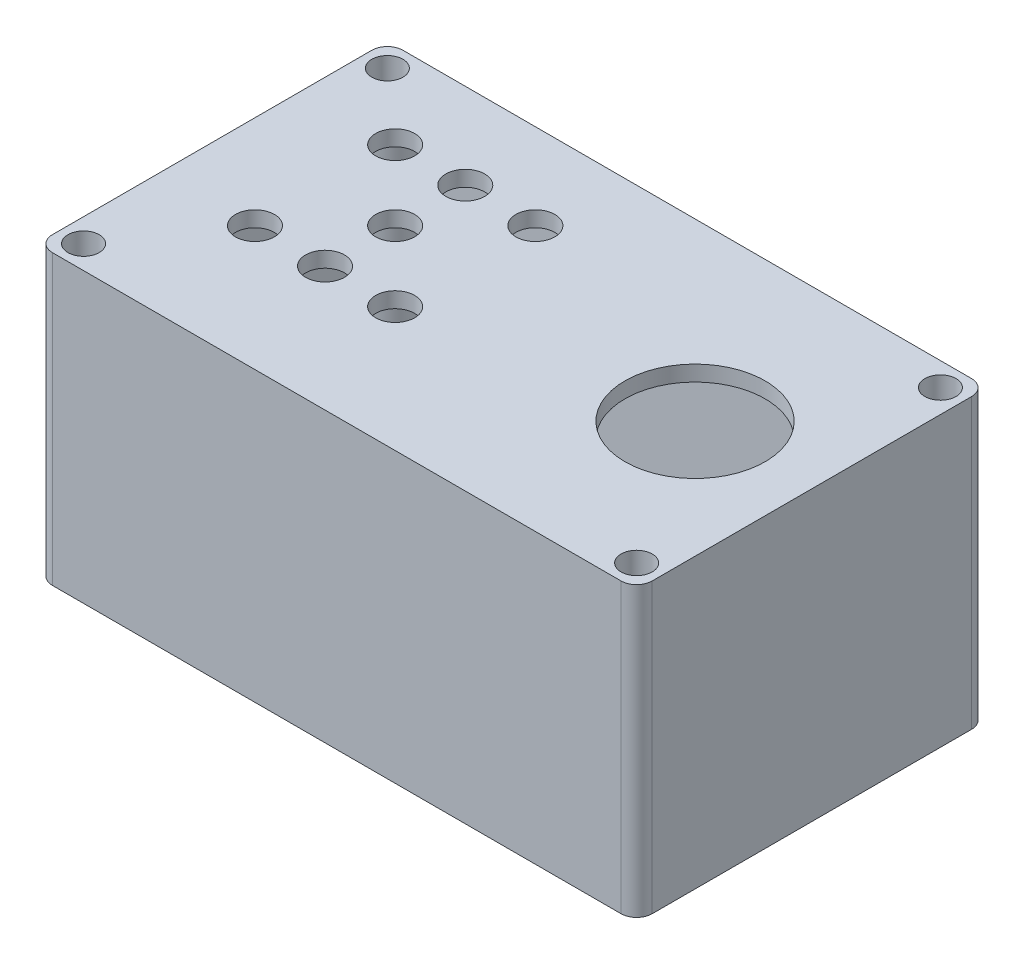
ISO-10303-21;
HEADER;
FILE_DESCRIPTION(('STEP AP214'),'2;1');
FILE_NAME('part.step','',(''),(''),'','','');
FILE_SCHEMA(('AUTOMOTIVE_DESIGN { 1 0 10303 214 1 1 1 1 }'));
ENDSEC;
DATA;
#1=APPLICATION_CONTEXT('core data for automotive mechanical design processes');
#2=APPLICATION_PROTOCOL_DEFINITION('international standard','automotive_design',2000,#1);
#3=PRODUCT_CONTEXT('',#1,'mechanical');
#4=PRODUCT('Part','Part','',(#3));
#5=PRODUCT_RELATED_PRODUCT_CATEGORY('part','',(#4));
#6=PRODUCT_DEFINITION_FORMATION('','',#4);
#7=PRODUCT_DEFINITION_CONTEXT('part definition',#1,'design');
#8=PRODUCT_DEFINITION('design','',#6,#7);
#9=PRODUCT_DEFINITION_SHAPE('','',#8);
#10=(LENGTH_UNIT() NAMED_UNIT(*) SI_UNIT(.MILLI.,.METRE.));
#11=(NAMED_UNIT(*) PLANE_ANGLE_UNIT() SI_UNIT($,.RADIAN.));
#12=(NAMED_UNIT(*) SI_UNIT($,.STERADIAN.) SOLID_ANGLE_UNIT());
#13=UNCERTAINTY_MEASURE_WITH_UNIT(LENGTH_MEASURE(1.E-05),#10,'distance_accuracy_value','');
#14=(GEOMETRIC_REPRESENTATION_CONTEXT(3) GLOBAL_UNCERTAINTY_ASSIGNED_CONTEXT((#13)) GLOBAL_UNIT_ASSIGNED_CONTEXT((#10,
#11,#12)) REPRESENTATION_CONTEXT('',''));
#15=CARTESIAN_POINT('',(0.,0.,0.));
#16=DIRECTION('',(0.,0.,1.));
#17=DIRECTION('',(1.,0.,0.));
#18=AXIS2_PLACEMENT_3D('',#15,#16,#17);
#19=CARTESIAN_POINT('',(-8.50000000000001,0.,-11.5));
#20=DIRECTION('',(0.,1.,0.));
#21=DIRECTION('',(0.,0.,1.));
#22=AXIS2_PLACEMENT_3D('',#19,#20,#21);
#23=CYLINDRICAL_SURFACE('',#22,2.5);
#24=CARTESIAN_POINT('',(-8.50000000000001,35.,-11.5));
#25=DIRECTION('',(0.,-1.,0.));
#26=DIRECTION('',(0.,0.,-1.));
#27=AXIS2_PLACEMENT_3D('',#24,#25,#26);
#28=CIRCLE('',#27,2.5);
#29=CARTESIAN_POINT('',(-8.50000000000001,35.,-14.));
#30=VERTEX_POINT('',#29);
#31=EDGE_CURVE('E303',#30,#30,#28,.T.);
#32=ORIENTED_EDGE('',*,*,#31,.T.);
#33=EDGE_LOOP('',(#32));
#34=FACE_BOUND('',#33,.T.);
#35=CARTESIAN_POINT('',(-8.50000000000001,37.,-11.5));
#36=DIRECTION('',(0.,1.,0.));
#37=DIRECTION('',(0.,0.,1.));
#38=AXIS2_PLACEMENT_3D('',#35,#36,#37);
#39=CIRCLE('',#38,2.5);
#40=CARTESIAN_POINT('',(-8.50000000000001,37.,-9.));
#41=VERTEX_POINT('',#40);
#42=EDGE_CURVE('E324',#41,#41,#39,.T.);
#43=ORIENTED_EDGE('',*,*,#42,.T.);
#44=EDGE_LOOP('',(#43));
#45=FACE_BOUND('',#44,.T.);
#46=ADVANCED_FACE('F41',(#34,#45),#23,.F.);
#47=CARTESIAN_POINT('',(0.,0.,0.));
#48=DIRECTION('',(0.,-1.,0.));
#49=DIRECTION('',(0.,0.,-1.));
#50=AXIS2_PLACEMENT_3D('',#47,#48,#49);
#51=PLANE('',#50);
#52=CARTESIAN_POINT('',(-35.5,0.,-19.5));
#53=DIRECTION('',(0.,-1.,0.));
#54=DIRECTION('',(0.,0.,1.));
#55=AXIS2_PLACEMENT_3D('',#52,#53,#54);
#56=CIRCLE('',#55,2.);
#57=CARTESIAN_POINT('',(-35.5,0.,-17.5));
#58=VERTEX_POINT('',#57);
#59=EDGE_CURVE('E255',#58,#58,#56,.T.);
#60=ORIENTED_EDGE('',*,*,#59,.F.);
#61=EDGE_LOOP('',(#60));
#62=FACE_BOUND('',#61,.T.);
#63=CARTESIAN_POINT('',(35.5,0.,-19.5));
#64=DIRECTION('',(0.,-1.,0.));
#65=DIRECTION('',(0.,0.,-1.));
#66=AXIS2_PLACEMENT_3D('',#63,#64,#65);
#67=CIRCLE('',#66,2.);
#68=CARTESIAN_POINT('',(35.5,0.,-21.5));
#69=VERTEX_POINT('',#68);
#70=EDGE_CURVE('E269',#69,#69,#67,.T.);
#71=ORIENTED_EDGE('',*,*,#70,.F.);
#72=EDGE_LOOP('',(#71));
#73=FACE_BOUND('',#72,.T.);
#74=CARTESIAN_POINT('',(35.5,0.,19.5));
#75=DIRECTION('',(0.,-1.,0.));
#76=DIRECTION('',(0.,0.,1.));
#77=AXIS2_PLACEMENT_3D('',#74,#75,#76);
#78=CIRCLE('',#77,2.);
#79=CARTESIAN_POINT('',(35.5,0.,21.5));
#80=VERTEX_POINT('',#79);
#81=EDGE_CURVE('E261',#80,#80,#78,.T.);
#82=ORIENTED_EDGE('',*,*,#81,.F.);
#83=EDGE_LOOP('',(#82));
#84=FACE_BOUND('',#83,.T.);
#85=CARTESIAN_POINT('',(-35.5,0.,19.5));
#86=DIRECTION('',(0.,-1.,0.));
#87=DIRECTION('',(0.,0.,-1.));
#88=AXIS2_PLACEMENT_3D('',#85,#86,#87);
#89=CIRCLE('',#88,2.);
#90=CARTESIAN_POINT('',(-35.5,0.,17.5));
#91=VERTEX_POINT('',#90);
#92=EDGE_CURVE('E260',#91,#91,#89,.T.);
#93=ORIENTED_EDGE('',*,*,#92,.F.);
#94=EDGE_LOOP('',(#93));
#95=FACE_BOUND('',#94,.T.);
#96=DIRECTION('',(-1.,0.,0.));
#97=VECTOR('',#96,1.);
#98=CARTESIAN_POINT('',(-38.5,0.,-22.5));
#99=LINE('',#98,#97);
#100=CARTESIAN_POINT('',(36.5,0.,-22.5));
#101=VERTEX_POINT('',#100);
#102=CARTESIAN_POINT('',(-36.5,0.,-22.5));
#103=VERTEX_POINT('',#102);
#104=EDGE_CURVE('E307',#101,#103,#99,.T.);
#105=ORIENTED_EDGE('',*,*,#104,.F.);
#106=CARTESIAN_POINT('',(36.5,0.,-20.5));
#107=DIRECTION('',(0.,-1.,0.));
#108=DIRECTION('',(0.,0.,-1.));
#109=AXIS2_PLACEMENT_3D('',#106,#107,#108);
#110=CIRCLE('',#109,2.);
#111=CARTESIAN_POINT('',(38.5,0.,-20.5));
#112=VERTEX_POINT('',#111);
#113=EDGE_CURVE('E362',#101,#112,#110,.T.);
#114=ORIENTED_EDGE('',*,*,#113,.T.);
#115=DIRECTION('',(0.,0.,-1.));
#116=VECTOR('',#115,1.);
#117=CARTESIAN_POINT('',(38.5,0.,22.5));
#118=LINE('',#117,#116);
#119=CARTESIAN_POINT('',(38.5,0.,20.5));
#120=VERTEX_POINT('',#119);
#121=EDGE_CURVE('E284',#120,#112,#118,.T.);
#122=ORIENTED_EDGE('',*,*,#121,.F.);
#123=CARTESIAN_POINT('',(36.5,0.,20.5));
#124=DIRECTION('',(0.,-1.,0.));
#125=DIRECTION('',(0.,0.,-1.));
#126=AXIS2_PLACEMENT_3D('',#123,#124,#125);
#127=CIRCLE('',#126,2.);
#128=CARTESIAN_POINT('',(36.5,0.,22.5));
#129=VERTEX_POINT('',#128);
#130=EDGE_CURVE('E359',#120,#129,#127,.T.);
#131=ORIENTED_EDGE('',*,*,#130,.T.);
#132=DIRECTION('',(1.,0.,0.));
#133=VECTOR('',#132,1.);
#134=CARTESIAN_POINT('',(-38.5,0.,22.5));
#135=LINE('',#134,#133);
#136=CARTESIAN_POINT('',(-36.5,0.,22.5));
#137=VERTEX_POINT('',#136);
#138=EDGE_CURVE('E293',#137,#129,#135,.T.);
#139=ORIENTED_EDGE('',*,*,#138,.F.);
#140=CARTESIAN_POINT('',(-36.5,0.,20.5));
#141=DIRECTION('',(0.,-1.,0.));
#142=DIRECTION('',(0.,0.,-1.));
#143=AXIS2_PLACEMENT_3D('',#140,#141,#142);
#144=CIRCLE('',#143,2.);
#145=CARTESIAN_POINT('',(-38.5,0.,20.5));
#146=VERTEX_POINT('',#145);
#147=EDGE_CURVE('E356',#137,#146,#144,.T.);
#148=ORIENTED_EDGE('',*,*,#147,.T.);
#149=DIRECTION('',(0.,0.,1.));
#150=VECTOR('',#149,1.);
#151=CARTESIAN_POINT('',(-38.5,0.,22.5));
#152=LINE('',#151,#150);
#153=CARTESIAN_POINT('',(-38.5,0.,-20.5));
#154=VERTEX_POINT('',#153);
#155=EDGE_CURVE('E311',#154,#146,#152,.T.);
#156=ORIENTED_EDGE('',*,*,#155,.F.);
#157=CARTESIAN_POINT('',(-36.5,0.,-20.5));
#158=DIRECTION('',(0.,-1.,0.));
#159=DIRECTION('',(0.,0.,-1.));
#160=AXIS2_PLACEMENT_3D('',#157,#158,#159);
#161=CIRCLE('',#160,2.);
#162=EDGE_CURVE('E353',#154,#103,#161,.T.);
#163=ORIENTED_EDGE('',*,*,#162,.T.);
#164=EDGE_LOOP('',(#105,#114,#122,#131,#139,#148,#156,#163));
#165=FACE_BOUND('',#164,.T.);
#166=CARTESIAN_POINT('',(-35.5,0.,19.5));
#167=DIRECTION('',(0.,-1.,0.));
#168=DIRECTION('',(0.,0.,-1.));
#169=AXIS2_PLACEMENT_3D('',#166,#167,#168);
#170=CIRCLE('',#169,4.);
#171=CARTESIAN_POINT('',(-36.5,0.,15.6270166537926));
#172=VERTEX_POINT('',#171);
#173=CARTESIAN_POINT('',(-31.6270166537926,0.,20.5));
#174=VERTEX_POINT('',#173);
#175=EDGE_CURVE('E208',#172,#174,#170,.T.);
#176=ORIENTED_EDGE('',*,*,#175,.T.);
#177=DIRECTION('',(1.,0.,0.));
#178=VECTOR('',#177,1.);
#179=CARTESIAN_POINT('',(0.,0.,20.5));
#180=LINE('',#179,#178);
#181=CARTESIAN_POINT('',(31.6270166537926,0.,20.5));
#182=VERTEX_POINT('',#181);
#183=EDGE_CURVE('E216',#174,#182,#180,.T.);
#184=ORIENTED_EDGE('',*,*,#183,.T.);
#185=CARTESIAN_POINT('',(35.5,0.,19.5));
#186=DIRECTION('',(0.,-1.,0.));
#187=DIRECTION('',(0.,0.,-1.));
#188=AXIS2_PLACEMENT_3D('',#185,#186,#187);
#189=CIRCLE('',#188,4.);
#190=CARTESIAN_POINT('',(36.5,0.,15.6270166537926));
#191=VERTEX_POINT('',#190);
#192=EDGE_CURVE('E203',#182,#191,#189,.T.);
#193=ORIENTED_EDGE('',*,*,#192,.T.);
#194=DIRECTION('',(0.,0.,-1.));
#195=VECTOR('',#194,1.);
#196=CARTESIAN_POINT('',(36.5,0.,0.));
#197=LINE('',#196,#195);
#198=CARTESIAN_POINT('',(36.5,0.,-15.6270166537926));
#199=VERTEX_POINT('',#198);
#200=EDGE_CURVE('E211',#191,#199,#197,.T.);
#201=ORIENTED_EDGE('',*,*,#200,.T.);
#202=CARTESIAN_POINT('',(35.5,0.,-19.5));
#203=DIRECTION('',(0.,-1.,0.));
#204=DIRECTION('',(0.,0.,-1.));
#205=AXIS2_PLACEMENT_3D('',#202,#203,#204);
#206=CIRCLE('',#205,4.);
#207=CARTESIAN_POINT('',(31.6270166537926,0.,-20.5));
#208=VERTEX_POINT('',#207);
#209=EDGE_CURVE('E177',#199,#208,#206,.T.);
#210=ORIENTED_EDGE('',*,*,#209,.T.);
#211=DIRECTION('',(-1.,0.,0.));
#212=VECTOR('',#211,1.);
#213=CARTESIAN_POINT('',(0.,0.,-20.5));
#214=LINE('',#213,#212);
#215=CARTESIAN_POINT('',(-31.6270166537926,0.,-20.5));
#216=VERTEX_POINT('',#215);
#217=EDGE_CURVE('E215',#208,#216,#214,.T.);
#218=ORIENTED_EDGE('',*,*,#217,.T.);
#219=CARTESIAN_POINT('',(-35.5,0.,-19.5));
#220=DIRECTION('',(0.,-1.,0.));
#221=DIRECTION('',(0.,0.,-1.));
#222=AXIS2_PLACEMENT_3D('',#219,#220,#221);
#223=CIRCLE('',#222,4.);
#224=CARTESIAN_POINT('',(-36.5,0.,-15.6270166537926));
#225=VERTEX_POINT('',#224);
#226=EDGE_CURVE('E178',#216,#225,#223,.T.);
#227=ORIENTED_EDGE('',*,*,#226,.T.);
#228=DIRECTION('',(0.,0.,1.));
#229=VECTOR('',#228,1.);
#230=CARTESIAN_POINT('',(-36.5,0.,0.));
#231=LINE('',#230,#229);
#232=EDGE_CURVE('E162',#225,#172,#231,.T.);
#233=ORIENTED_EDGE('',*,*,#232,.T.);
#234=EDGE_LOOP('',(#176,#184,#193,#201,#210,#218,#227,#233));
#235=FACE_BOUND('',#234,.T.);
#236=ADVANCED_FACE('F400',(#62,#73,#84,#95,#165,#235),#51,.T.);
#237=CARTESIAN_POINT('',(38.5,37.,22.5));
#238=DIRECTION('',(-1.,0.,0.));
#239=DIRECTION('',(0.,0.,1.));
#240=AXIS2_PLACEMENT_3D('',#237,#238,#239);
#241=PLANE('',#240);
#242=ORIENTED_EDGE('',*,*,#121,.T.);
#243=DIRECTION('',(0.,-1.,0.));
#244=VECTOR('',#243,1.);
#245=CARTESIAN_POINT('',(38.5,37.,-20.5));
#246=LINE('',#245,#244);
#247=CARTESIAN_POINT('',(38.5,37.,-20.5));
#248=VERTEX_POINT('',#247);
#249=EDGE_CURVE('E369',#112,#248,#246,.F.);
#250=ORIENTED_EDGE('',*,*,#249,.T.);
#251=DIRECTION('',(0.,0.,-1.));
#252=VECTOR('',#251,1.);
#253=CARTESIAN_POINT('',(38.5,37.,22.5));
#254=LINE('',#253,#252);
#255=CARTESIAN_POINT('',(38.5,37.,20.5));
#256=VERTEX_POINT('',#255);
#257=EDGE_CURVE('E288',#256,#248,#254,.T.);
#258=ORIENTED_EDGE('',*,*,#257,.F.);
#259=DIRECTION('',(0.,-1.,0.));
#260=VECTOR('',#259,1.);
#261=CARTESIAN_POINT('',(38.5,37.,20.5));
#262=LINE('',#261,#260);
#263=EDGE_CURVE('E365',#256,#120,#262,.T.);
#264=ORIENTED_EDGE('',*,*,#263,.T.);
#265=EDGE_LOOP('',(#242,#250,#258,#264));
#266=FACE_BOUND('',#265,.T.);
#267=ADVANCED_FACE('F416',(#266),#241,.F.);
#268=CARTESIAN_POINT('',(-38.5,37.,-22.5));
#269=DIRECTION('',(0.,0.,1.));
#270=DIRECTION('',(1.,0.,0.));
#271=AXIS2_PLACEMENT_3D('',#268,#269,#270);
#272=PLANE('',#271);
#273=DIRECTION('',(-1.,0.,0.));
#274=VECTOR('',#273,1.);
#275=CARTESIAN_POINT('',(-38.5,37.,-22.5));
#276=LINE('',#275,#274);
#277=CARTESIAN_POINT('',(36.5,37.,-22.5));
#278=VERTEX_POINT('',#277);
#279=CARTESIAN_POINT('',(-36.5,37.,-22.5));
#280=VERTEX_POINT('',#279);
#281=EDGE_CURVE('E292',#278,#280,#276,.T.);
#282=ORIENTED_EDGE('',*,*,#281,.F.);
#283=DIRECTION('',(0.,-1.,0.));
#284=VECTOR('',#283,1.);
#285=CARTESIAN_POINT('',(36.5,37.,-22.5));
#286=LINE('',#285,#284);
#287=EDGE_CURVE('E349',#278,#101,#286,.T.);
#288=ORIENTED_EDGE('',*,*,#287,.T.);
#289=ORIENTED_EDGE('',*,*,#104,.T.);
#290=DIRECTION('',(0.,-1.,0.));
#291=VECTOR('',#290,1.);
#292=CARTESIAN_POINT('',(-36.5,37.,-22.5));
#293=LINE('',#292,#291);
#294=EDGE_CURVE('E328',#103,#280,#293,.F.);
#295=ORIENTED_EDGE('',*,*,#294,.T.);
#296=EDGE_LOOP('',(#282,#288,#289,#295));
#297=FACE_BOUND('',#296,.T.);
#298=ADVANCED_FACE('F424',(#297),#272,.F.);
#299=CARTESIAN_POINT('',(-38.5,37.,22.5));
#300=DIRECTION('',(1.,0.,0.));
#301=DIRECTION('',(0.,0.,-1.));
#302=AXIS2_PLACEMENT_3D('',#299,#300,#301);
#303=PLANE('',#302);
#304=ORIENTED_EDGE('',*,*,#155,.T.);
#305=DIRECTION('',(0.,-1.,0.));
#306=VECTOR('',#305,1.);
#307=CARTESIAN_POINT('',(-38.5,37.,20.5));
#308=LINE('',#307,#306);
#309=CARTESIAN_POINT('',(-38.5,37.,20.5));
#310=VERTEX_POINT('',#309);
#311=EDGE_CURVE('E11',#146,#310,#308,.F.);
#312=ORIENTED_EDGE('',*,*,#311,.T.);
#313=DIRECTION('',(0.,0.,1.));
#314=VECTOR('',#313,1.);
#315=CARTESIAN_POINT('',(-38.5,37.,22.5));
#316=LINE('',#315,#314);
#317=CARTESIAN_POINT('',(-38.5,37.,-20.5));
#318=VERTEX_POINT('',#317);
#319=EDGE_CURVE('E297',#318,#310,#316,.T.);
#320=ORIENTED_EDGE('',*,*,#319,.F.);
#321=DIRECTION('',(0.,-1.,0.));
#322=VECTOR('',#321,1.);
#323=CARTESIAN_POINT('',(-38.5,37.,-20.5));
#324=LINE('',#323,#322);
#325=EDGE_CURVE('E50',#318,#154,#324,.T.);
#326=ORIENTED_EDGE('',*,*,#325,.T.);
#327=EDGE_LOOP('',(#304,#312,#320,#326));
#328=FACE_BOUND('',#327,.T.);
#329=ADVANCED_FACE('F394',(#328),#303,.F.);
#330=CARTESIAN_POINT('',(-38.5,37.,22.5));
#331=DIRECTION('',(0.,0.,-1.));
#332=DIRECTION('',(-1.,0.,0.));
#333=AXIS2_PLACEMENT_3D('',#330,#331,#332);
#334=PLANE('',#333);
#335=ORIENTED_EDGE('',*,*,#138,.T.);
#336=DIRECTION('',(0.,-1.,0.));
#337=VECTOR('',#336,1.);
#338=CARTESIAN_POINT('',(36.5,37.,22.5));
#339=LINE('',#338,#337);
#340=CARTESIAN_POINT('',(36.5,37.,22.5));
#341=VERTEX_POINT('',#340);
#342=EDGE_CURVE('E57',#129,#341,#339,.F.);
#343=ORIENTED_EDGE('',*,*,#342,.T.);
#344=DIRECTION('',(1.,0.,0.));
#345=VECTOR('',#344,1.);
#346=CARTESIAN_POINT('',(-38.5,37.,22.5));
#347=LINE('',#346,#345);
#348=CARTESIAN_POINT('',(-36.5,37.,22.5));
#349=VERTEX_POINT('',#348);
#350=EDGE_CURVE('E300',#349,#341,#347,.T.);
#351=ORIENTED_EDGE('',*,*,#350,.F.);
#352=DIRECTION('',(0.,-1.,0.));
#353=VECTOR('',#352,1.);
#354=CARTESIAN_POINT('',(-36.5,37.,22.5));
#355=LINE('',#354,#353);
#356=EDGE_CURVE('E383',#349,#137,#355,.T.);
#357=ORIENTED_EDGE('',*,*,#356,.T.);
#358=EDGE_LOOP('',(#335,#343,#351,#357));
#359=FACE_BOUND('',#358,.T.);
#360=ADVANCED_FACE('F406',(#359),#334,.F.);
#361=CARTESIAN_POINT('',(0.,37.,0.));
#362=DIRECTION('',(0.,-1.,0.));
#363=DIRECTION('',(0.,0.,-1.));
#364=AXIS2_PLACEMENT_3D('',#361,#362,#363);
#365=PLANE('',#364);
#366=CARTESIAN_POINT('',(23.5,37.,0.));
#367=DIRECTION('',(0.,1.,0.));
#368=DIRECTION('',(0.,0.,1.));
#369=AXIS2_PLACEMENT_3D('',#366,#367,#368);
#370=CIRCLE('',#369,9.);
#371=CARTESIAN_POINT('',(23.5,37.,9.));
#372=VERTEX_POINT('',#371);
#373=EDGE_CURVE('E715',#372,#372,#370,.T.);
#374=ORIENTED_EDGE('',*,*,#373,.F.);
#375=EDGE_LOOP('',(#374));
#376=FACE_BOUND('',#375,.T.);
#377=CARTESIAN_POINT('',(-17.5,37.,-2.5));
#378=DIRECTION('',(0.,1.,0.));
#379=DIRECTION('',(0.,0.,1.));
#380=AXIS2_PLACEMENT_3D('',#377,#378,#379);
#381=CIRCLE('',#380,2.5);
#382=CARTESIAN_POINT('',(-17.5,37.,0.));
#383=VERTEX_POINT('',#382);
#384=EDGE_CURVE('E334',#383,#383,#381,.T.);
#385=ORIENTED_EDGE('',*,*,#384,.F.);
#386=EDGE_LOOP('',(#385));
#387=FACE_BOUND('',#386,.T.);
#388=CARTESIAN_POINT('',(-26.5,37.,6.5));
#389=DIRECTION('',(0.,1.,0.));
#390=DIRECTION('',(0.,0.,1.));
#391=AXIS2_PLACEMENT_3D('',#388,#389,#390);
#392=CIRCLE('',#391,2.5);
#393=CARTESIAN_POINT('',(-26.5,37.,9.));
#394=VERTEX_POINT('',#393);
#395=EDGE_CURVE('E722',#394,#394,#392,.T.);
#396=ORIENTED_EDGE('',*,*,#395,.F.);
#397=EDGE_LOOP('',(#396));
#398=FACE_BOUND('',#397,.T.);
#399=CARTESIAN_POINT('',(-17.5,37.,6.5));
#400=DIRECTION('',(0.,1.,0.));
#401=DIRECTION('',(0.,0.,1.));
#402=AXIS2_PLACEMENT_3D('',#399,#400,#401);
#403=CIRCLE('',#402,2.5);
#404=CARTESIAN_POINT('',(-17.5,37.,9.));
#405=VERTEX_POINT('',#404);
#406=EDGE_CURVE('E726',#405,#405,#403,.T.);
#407=ORIENTED_EDGE('',*,*,#406,.F.);
#408=EDGE_LOOP('',(#407));
#409=FACE_BOUND('',#408,.T.);
#410=CARTESIAN_POINT('',(-8.50000000000001,37.,6.5));
#411=DIRECTION('',(0.,1.,0.));
#412=DIRECTION('',(0.,0.,1.));
#413=AXIS2_PLACEMENT_3D('',#410,#411,#412);
#414=CIRCLE('',#413,2.5);
#415=CARTESIAN_POINT('',(-8.50000000000001,37.,9.));
#416=VERTEX_POINT('',#415);
#417=EDGE_CURVE('E730',#416,#416,#414,.T.);
#418=ORIENTED_EDGE('',*,*,#417,.F.);
#419=EDGE_LOOP('',(#418));
#420=FACE_BOUND('',#419,.T.);
#421=CARTESIAN_POINT('',(-17.5,37.,-11.5));
#422=DIRECTION('',(0.,1.,0.));
#423=DIRECTION('',(0.,0.,1.));
#424=AXIS2_PLACEMENT_3D('',#421,#422,#423);
#425=CIRCLE('',#424,2.5);
#426=CARTESIAN_POINT('',(-17.5,37.,-9.));
#427=VERTEX_POINT('',#426);
#428=EDGE_CURVE('E734',#427,#427,#425,.T.);
#429=ORIENTED_EDGE('',*,*,#428,.F.);
#430=EDGE_LOOP('',(#429));
#431=FACE_BOUND('',#430,.T.);
#432=CARTESIAN_POINT('',(-26.5,37.,-11.5));
#433=DIRECTION('',(0.,1.,0.));
#434=DIRECTION('',(0.,0.,1.));
#435=AXIS2_PLACEMENT_3D('',#432,#433,#434);
#436=CIRCLE('',#435,2.5);
#437=CARTESIAN_POINT('',(-26.5,37.,-9.));
#438=VERTEX_POINT('',#437);
#439=EDGE_CURVE('E320',#438,#438,#436,.T.);
#440=ORIENTED_EDGE('',*,*,#439,.F.);
#441=EDGE_LOOP('',(#440));
#442=FACE_BOUND('',#441,.T.);
#443=CARTESIAN_POINT('',(-35.5,37.,-19.5));
#444=DIRECTION('',(0.,-1.,0.));
#445=DIRECTION('',(0.,0.,1.));
#446=AXIS2_PLACEMENT_3D('',#443,#444,#445);
#447=CIRCLE('',#446,2.);
#448=CARTESIAN_POINT('',(-35.5,37.,-17.5));
#449=VERTEX_POINT('',#448);
#450=EDGE_CURVE('E273',#449,#449,#447,.T.);
#451=ORIENTED_EDGE('',*,*,#450,.T.);
#452=EDGE_LOOP('',(#451));
#453=FACE_BOUND('',#452,.T.);
#454=CARTESIAN_POINT('',(35.5,37.,-19.5));
#455=DIRECTION('',(0.,-1.,0.));
#456=DIRECTION('',(0.,0.,-1.));
#457=AXIS2_PLACEMENT_3D('',#454,#455,#456);
#458=CIRCLE('',#457,2.);
#459=CARTESIAN_POINT('',(35.5,37.,-21.5));
#460=VERTEX_POINT('',#459);
#461=EDGE_CURVE('E265',#460,#460,#458,.T.);
#462=ORIENTED_EDGE('',*,*,#461,.T.);
#463=EDGE_LOOP('',(#462));
#464=FACE_BOUND('',#463,.T.);
#465=CARTESIAN_POINT('',(35.5,37.,19.5));
#466=DIRECTION('',(0.,-1.,0.));
#467=DIRECTION('',(0.,0.,1.));
#468=AXIS2_PLACEMENT_3D('',#465,#466,#467);
#469=CIRCLE('',#468,2.);
#470=CARTESIAN_POINT('',(35.5,37.,21.5));
#471=VERTEX_POINT('',#470);
#472=EDGE_CURVE('E256',#471,#471,#469,.T.);
#473=ORIENTED_EDGE('',*,*,#472,.T.);
#474=EDGE_LOOP('',(#473));
#475=FACE_BOUND('',#474,.T.);
#476=CARTESIAN_POINT('',(-35.5,37.,19.5));
#477=DIRECTION('',(0.,-1.,0.));
#478=DIRECTION('',(0.,0.,-1.));
#479=AXIS2_PLACEMENT_3D('',#476,#477,#478);
#480=CIRCLE('',#479,2.);
#481=CARTESIAN_POINT('',(-35.5,37.,17.5));
#482=VERTEX_POINT('',#481);
#483=EDGE_CURVE('E280',#482,#482,#480,.T.);
#484=ORIENTED_EDGE('',*,*,#483,.T.);
#485=EDGE_LOOP('',(#484));
#486=FACE_BOUND('',#485,.T.);
#487=ORIENTED_EDGE('',*,*,#257,.T.);
#488=CARTESIAN_POINT('',(36.5,37.,-20.5));
#489=DIRECTION('',(0.,-1.,0.));
#490=DIRECTION('',(0.,0.,-1.));
#491=AXIS2_PLACEMENT_3D('',#488,#489,#490);
#492=CIRCLE('',#491,2.);
#493=EDGE_CURVE('E380',#248,#278,#492,.F.);
#494=ORIENTED_EDGE('',*,*,#493,.T.);
#495=ORIENTED_EDGE('',*,*,#281,.T.);
#496=CARTESIAN_POINT('',(-36.5,37.,-20.5));
#497=DIRECTION('',(0.,-1.,0.));
#498=DIRECTION('',(0.,0.,-1.));
#499=AXIS2_PLACEMENT_3D('',#496,#497,#498);
#500=CIRCLE('',#499,2.);
#501=EDGE_CURVE('E372',#280,#318,#500,.F.);
#502=ORIENTED_EDGE('',*,*,#501,.T.);
#503=ORIENTED_EDGE('',*,*,#319,.T.);
#504=CARTESIAN_POINT('',(-36.5,37.,20.5));
#505=DIRECTION('',(0.,-1.,0.));
#506=DIRECTION('',(0.,0.,-1.));
#507=AXIS2_PLACEMENT_3D('',#504,#505,#506);
#508=CIRCLE('',#507,2.);
#509=EDGE_CURVE('E64',#310,#349,#508,.F.);
#510=ORIENTED_EDGE('',*,*,#509,.T.);
#511=ORIENTED_EDGE('',*,*,#350,.T.);
#512=CARTESIAN_POINT('',(36.5,37.,20.5));
#513=DIRECTION('',(0.,-1.,0.));
#514=DIRECTION('',(0.,0.,-1.));
#515=AXIS2_PLACEMENT_3D('',#512,#513,#514);
#516=CIRCLE('',#515,2.);
#517=EDGE_CURVE('E377',#341,#256,#516,.F.);
#518=ORIENTED_EDGE('',*,*,#517,.T.);
#519=EDGE_LOOP('',(#487,#494,#495,#502,#503,#510,#511,#518));
#520=FACE_BOUND('',#519,.T.);
#521=ORIENTED_EDGE('',*,*,#42,.F.);
#522=EDGE_LOOP('',(#521));
#523=FACE_BOUND('',#522,.T.);
#524=ADVANCED_FACE('F408',(#376,#387,#398,#409,#420,#431,#442,#453,#464,#475,#486,#520,#523),
#365,.F.);
#525=CARTESIAN_POINT('',(-35.5,37.,19.5));
#526=DIRECTION('',(0.,-1.,0.));
#527=DIRECTION('',(0.,0.,-1.));
#528=AXIS2_PLACEMENT_3D('',#525,#526,#527);
#529=CYLINDRICAL_SURFACE('',#528,2.);
#530=ORIENTED_EDGE('',*,*,#483,.F.);
#531=EDGE_LOOP('',(#530));
#532=FACE_BOUND('',#531,.T.);
#533=ORIENTED_EDGE('',*,*,#92,.T.);
#534=EDGE_LOOP('',(#533));
#535=FACE_BOUND('',#534,.T.);
#536=ADVANCED_FACE('F642',(#532,#535),#529,.F.);
#537=CARTESIAN_POINT('',(35.5,37.,19.5));
#538=DIRECTION('',(0.,-1.,0.));
#539=DIRECTION('',(0.,0.,-1.));
#540=AXIS2_PLACEMENT_3D('',#537,#538,#539);
#541=CYLINDRICAL_SURFACE('',#540,2.);
#542=ORIENTED_EDGE('',*,*,#472,.F.);
#543=EDGE_LOOP('',(#542));
#544=FACE_BOUND('',#543,.T.);
#545=ORIENTED_EDGE('',*,*,#81,.T.);
#546=EDGE_LOOP('',(#545));
#547=FACE_BOUND('',#546,.T.);
#548=ADVANCED_FACE('F633',(#544,#547),#541,.F.);
#549=CARTESIAN_POINT('',(35.5,37.,-19.5));
#550=DIRECTION('',(0.,-1.,0.));
#551=DIRECTION('',(0.,0.,-1.));
#552=AXIS2_PLACEMENT_3D('',#549,#550,#551);
#553=CYLINDRICAL_SURFACE('',#552,2.);
#554=ORIENTED_EDGE('',*,*,#461,.F.);
#555=EDGE_LOOP('',(#554));
#556=FACE_BOUND('',#555,.T.);
#557=ORIENTED_EDGE('',*,*,#70,.T.);
#558=EDGE_LOOP('',(#557));
#559=FACE_BOUND('',#558,.T.);
#560=ADVANCED_FACE('F624',(#556,#559),#553,.F.);
#561=CARTESIAN_POINT('',(-35.5,37.,-19.5));
#562=DIRECTION('',(0.,-1.,0.));
#563=DIRECTION('',(0.,0.,-1.));
#564=AXIS2_PLACEMENT_3D('',#561,#562,#563);
#565=CYLINDRICAL_SURFACE('',#564,2.);
#566=ORIENTED_EDGE('',*,*,#450,.F.);
#567=EDGE_LOOP('',(#566));
#568=FACE_BOUND('',#567,.T.);
#569=ORIENTED_EDGE('',*,*,#59,.T.);
#570=EDGE_LOOP('',(#569));
#571=FACE_BOUND('',#570,.T.);
#572=ADVANCED_FACE('F610',(#568,#571),#565,.F.);
#573=CARTESIAN_POINT('',(36.5,37.,22.5));
#574=DIRECTION('',(-1.,0.,0.));
#575=DIRECTION('',(0.,0.,1.));
#576=AXIS2_PLACEMENT_3D('',#573,#574,#575);
#577=PLANE('',#576);
#578=ORIENTED_EDGE('',*,*,#200,.F.);
#579=DIRECTION('',(0.,-1.,0.));
#580=VECTOR('',#579,1.);
#581=CARTESIAN_POINT('',(36.5,37.,15.6270166537926));
#582=LINE('',#581,#580);
#583=CARTESIAN_POINT('',(36.5,35.,15.6270166537926));
#584=VERTEX_POINT('',#583);
#585=EDGE_CURVE('E242',#191,#584,#582,.F.);
#586=ORIENTED_EDGE('',*,*,#585,.T.);
#587=DIRECTION('',(0.,0.,-1.));
#588=VECTOR('',#587,1.);
#589=CARTESIAN_POINT('',(36.5,35.,0.));
#590=LINE('',#589,#588);
#591=CARTESIAN_POINT('',(36.5,35.,-15.6270166537926));
#592=VERTEX_POINT('',#591);
#593=EDGE_CURVE('E195',#584,#592,#590,.T.);
#594=ORIENTED_EDGE('',*,*,#593,.T.);
#595=DIRECTION('',(0.,-1.,0.));
#596=VECTOR('',#595,1.);
#597=CARTESIAN_POINT('',(36.5,37.,-15.6270166537926));
#598=LINE('',#597,#596);
#599=EDGE_CURVE('E168',#199,#592,#598,.F.);
#600=ORIENTED_EDGE('',*,*,#599,.F.);
#601=EDGE_LOOP('',(#578,#586,#594,#600));
#602=FACE_BOUND('',#601,.T.);
#603=ADVANCED_FACE('F601',(#602),#577,.T.);
#604=CARTESIAN_POINT('',(-38.5,37.,-20.5));
#605=DIRECTION('',(0.,0.,1.));
#606=DIRECTION('',(1.,0.,0.));
#607=AXIS2_PLACEMENT_3D('',#604,#605,#606);
#608=PLANE('',#607);
#609=ORIENTED_EDGE('',*,*,#217,.F.);
#610=DIRECTION('',(0.,-1.,0.));
#611=VECTOR('',#610,1.);
#612=CARTESIAN_POINT('',(31.6270166537926,37.,-20.5));
#613=LINE('',#612,#611);
#614=CARTESIAN_POINT('',(31.6270166537926,35.,-20.5));
#615=VERTEX_POINT('',#614);
#616=EDGE_CURVE('E248',#208,#615,#613,.F.);
#617=ORIENTED_EDGE('',*,*,#616,.T.);
#618=DIRECTION('',(-1.,0.,0.));
#619=VECTOR('',#618,1.);
#620=CARTESIAN_POINT('',(0.,35.,-20.5));
#621=LINE('',#620,#619);
#622=CARTESIAN_POINT('',(-31.6270166537926,35.,-20.5));
#623=VERTEX_POINT('',#622);
#624=EDGE_CURVE('E188',#615,#623,#621,.T.);
#625=ORIENTED_EDGE('',*,*,#624,.T.);
#626=DIRECTION('',(0.,-1.,0.));
#627=VECTOR('',#626,1.);
#628=CARTESIAN_POINT('',(-31.6270166537926,37.,-20.5));
#629=LINE('',#628,#627);
#630=EDGE_CURVE('E167',#216,#623,#629,.F.);
#631=ORIENTED_EDGE('',*,*,#630,.F.);
#632=EDGE_LOOP('',(#609,#617,#625,#631));
#633=FACE_BOUND('',#632,.T.);
#634=ADVANCED_FACE('F593',(#633),#608,.T.);
#635=CARTESIAN_POINT('',(-36.5,37.,22.5));
#636=DIRECTION('',(1.,0.,0.));
#637=DIRECTION('',(0.,0.,-1.));
#638=AXIS2_PLACEMENT_3D('',#635,#636,#637);
#639=PLANE('',#638);
#640=DIRECTION('',(0.,-1.,0.));
#641=VECTOR('',#640,1.);
#642=CARTESIAN_POINT('',(-36.5,37.,-15.6270166537926));
#643=LINE('',#642,#641);
#644=CARTESIAN_POINT('',(-36.5,35.,-15.6270166537926));
#645=VERTEX_POINT('',#644);
#646=EDGE_CURVE('E156',#225,#645,#643,.F.);
#647=ORIENTED_EDGE('',*,*,#646,.T.);
#648=DIRECTION('',(0.,0.,1.));
#649=VECTOR('',#648,1.);
#650=CARTESIAN_POINT('',(-36.5,35.,0.));
#651=LINE('',#650,#649);
#652=CARTESIAN_POINT('',(-36.5,35.,15.6270166537926));
#653=VERTEX_POINT('',#652);
#654=EDGE_CURVE('E160',#645,#653,#651,.T.);
#655=ORIENTED_EDGE('',*,*,#654,.T.);
#656=DIRECTION('',(0.,-1.,0.));
#657=VECTOR('',#656,1.);
#658=CARTESIAN_POINT('',(-36.5,37.,15.6270166537926));
#659=LINE('',#658,#657);
#660=EDGE_CURVE('E239',#172,#653,#659,.F.);
#661=ORIENTED_EDGE('',*,*,#660,.F.);
#662=ORIENTED_EDGE('',*,*,#232,.F.);
#663=EDGE_LOOP('',(#647,#655,#661,#662));
#664=FACE_BOUND('',#663,.T.);
#665=ADVANCED_FACE('F158',(#664),#639,.T.);
#666=CARTESIAN_POINT('',(-38.5,37.,20.5));
#667=DIRECTION('',(0.,0.,-1.));
#668=DIRECTION('',(-1.,0.,0.));
#669=AXIS2_PLACEMENT_3D('',#666,#667,#668);
#670=PLANE('',#669);
#671=ORIENTED_EDGE('',*,*,#183,.F.);
#672=DIRECTION('',(0.,-1.,0.));
#673=VECTOR('',#672,1.);
#674=CARTESIAN_POINT('',(-31.6270166537926,37.,20.5));
#675=LINE('',#674,#673);
#676=CARTESIAN_POINT('',(-31.6270166537926,35.,20.5));
#677=VERTEX_POINT('',#676);
#678=EDGE_CURVE('E193',#174,#677,#675,.F.);
#679=ORIENTED_EDGE('',*,*,#678,.T.);
#680=DIRECTION('',(1.,0.,0.));
#681=VECTOR('',#680,1.);
#682=CARTESIAN_POINT('',(0.,35.,20.5));
#683=LINE('',#682,#681);
#684=CARTESIAN_POINT('',(31.6270166537926,35.,20.5));
#685=VERTEX_POINT('',#684);
#686=EDGE_CURVE('E187',#677,#685,#683,.T.);
#687=ORIENTED_EDGE('',*,*,#686,.T.);
#688=DIRECTION('',(0.,-1.,0.));
#689=VECTOR('',#688,1.);
#690=CARTESIAN_POINT('',(31.6270166537926,37.,20.5));
#691=LINE('',#690,#689);
#692=EDGE_CURVE('E245',#182,#685,#691,.F.);
#693=ORIENTED_EDGE('',*,*,#692,.F.);
#694=EDGE_LOOP('',(#671,#679,#687,#693));
#695=FACE_BOUND('',#694,.T.);
#696=ADVANCED_FACE('F577',(#695),#670,.T.);
#697=CARTESIAN_POINT('',(0.,35.,0.));
#698=DIRECTION('',(0.,-1.,0.));
#699=DIRECTION('',(0.,0.,-1.));
#700=AXIS2_PLACEMENT_3D('',#697,#698,#699);
#701=PLANE('',#700);
#702=CARTESIAN_POINT('',(23.5,35.,0.));
#703=DIRECTION('',(0.,1.,0.));
#704=DIRECTION('',(0.,0.,1.));
#705=AXIS2_PLACEMENT_3D('',#702,#703,#704);
#706=CIRCLE('',#705,9.);
#707=CARTESIAN_POINT('',(23.5,35.,9.));
#708=VERTEX_POINT('',#707);
#709=EDGE_CURVE('E784',#708,#708,#706,.T.);
#710=ORIENTED_EDGE('',*,*,#709,.T.);
#711=EDGE_LOOP('',(#710));
#712=FACE_BOUND('',#711,.T.);
#713=CARTESIAN_POINT('',(-17.5,35.,-2.5));
#714=DIRECTION('',(0.,-1.,0.));
#715=DIRECTION('',(0.,0.,-1.));
#716=AXIS2_PLACEMENT_3D('',#713,#714,#715);
#717=CIRCLE('',#716,2.5);
#718=CARTESIAN_POINT('',(-17.5,35.,-5.));
#719=VERTEX_POINT('',#718);
#720=EDGE_CURVE('E342',#719,#719,#717,.T.);
#721=ORIENTED_EDGE('',*,*,#720,.F.);
#722=EDGE_LOOP('',(#721));
#723=FACE_BOUND('',#722,.T.);
#724=CARTESIAN_POINT('',(-26.5,35.,6.5));
#725=DIRECTION('',(0.,-1.,0.));
#726=DIRECTION('',(0.,0.,-1.));
#727=AXIS2_PLACEMENT_3D('',#724,#725,#726);
#728=CIRCLE('',#727,2.5);
#729=CARTESIAN_POINT('',(-26.5,35.,4.));
#730=VERTEX_POINT('',#729);
#731=EDGE_CURVE('E338',#730,#730,#728,.T.);
#732=ORIENTED_EDGE('',*,*,#731,.F.);
#733=EDGE_LOOP('',(#732));
#734=FACE_BOUND('',#733,.T.);
#735=CARTESIAN_POINT('',(-17.5,35.,6.5));
#736=DIRECTION('',(0.,-1.,0.));
#737=DIRECTION('',(0.,0.,-1.));
#738=AXIS2_PLACEMENT_3D('',#735,#736,#737);
#739=CIRCLE('',#738,2.5);
#740=CARTESIAN_POINT('',(-17.5,35.,4.));
#741=VERTEX_POINT('',#740);
#742=EDGE_CURVE('E333',#741,#741,#739,.T.);
#743=ORIENTED_EDGE('',*,*,#742,.F.);
#744=EDGE_LOOP('',(#743));
#745=FACE_BOUND('',#744,.T.);
#746=CARTESIAN_POINT('',(-8.50000000000001,35.,6.5));
#747=DIRECTION('',(0.,-1.,0.));
#748=DIRECTION('',(0.,0.,-1.));
#749=AXIS2_PLACEMENT_3D('',#746,#747,#748);
#750=CIRCLE('',#749,2.5);
#751=CARTESIAN_POINT('',(-8.50000000000001,35.,4.));
#752=VERTEX_POINT('',#751);
#753=EDGE_CURVE('E329',#752,#752,#750,.T.);
#754=ORIENTED_EDGE('',*,*,#753,.F.);
#755=EDGE_LOOP('',(#754));
#756=FACE_BOUND('',#755,.T.);
#757=CARTESIAN_POINT('',(-17.5,35.,-11.5));
#758=DIRECTION('',(0.,-1.,0.));
#759=DIRECTION('',(0.,0.,-1.));
#760=AXIS2_PLACEMENT_3D('',#757,#758,#759);
#761=CIRCLE('',#760,2.5);
#762=CARTESIAN_POINT('',(-17.5,35.,-14.));
#763=VERTEX_POINT('',#762);
#764=EDGE_CURVE('E346',#763,#763,#761,.T.);
#765=ORIENTED_EDGE('',*,*,#764,.F.);
#766=EDGE_LOOP('',(#765));
#767=FACE_BOUND('',#766,.T.);
#768=CARTESIAN_POINT('',(-26.5,35.,-11.5));
#769=DIRECTION('',(0.,-1.,0.));
#770=DIRECTION('',(0.,0.,-1.));
#771=AXIS2_PLACEMENT_3D('',#768,#769,#770);
#772=CIRCLE('',#771,2.5);
#773=CARTESIAN_POINT('',(-26.5,35.,-14.));
#774=VERTEX_POINT('',#773);
#775=EDGE_CURVE('E236',#774,#774,#772,.T.);
#776=ORIENTED_EDGE('',*,*,#775,.F.);
#777=EDGE_LOOP('',(#776));
#778=FACE_BOUND('',#777,.T.);
#779=CARTESIAN_POINT('',(-35.5,35.,19.5));
#780=DIRECTION('',(0.,-1.,0.));
#781=DIRECTION('',(0.,0.,-1.));
#782=AXIS2_PLACEMENT_3D('',#779,#780,#781);
#783=CIRCLE('',#782,4.);
#784=EDGE_CURVE('E185',#653,#677,#783,.T.);
#785=ORIENTED_EDGE('',*,*,#784,.F.);
#786=ORIENTED_EDGE('',*,*,#654,.F.);
#787=CARTESIAN_POINT('',(-35.5,35.,-19.5));
#788=DIRECTION('',(0.,-1.,0.));
#789=DIRECTION('',(0.,0.,-1.));
#790=AXIS2_PLACEMENT_3D('',#787,#788,#789);
#791=CIRCLE('',#790,4.);
#792=EDGE_CURVE('E171',#623,#645,#791,.T.);
#793=ORIENTED_EDGE('',*,*,#792,.F.);
#794=ORIENTED_EDGE('',*,*,#624,.F.);
#795=CARTESIAN_POINT('',(35.5,35.,-19.5));
#796=DIRECTION('',(0.,-1.,0.));
#797=DIRECTION('',(0.,0.,-1.));
#798=AXIS2_PLACEMENT_3D('',#795,#796,#797);
#799=CIRCLE('',#798,4.);
#800=EDGE_CURVE('E199',#592,#615,#799,.T.);
#801=ORIENTED_EDGE('',*,*,#800,.F.);
#802=ORIENTED_EDGE('',*,*,#593,.F.);
#803=CARTESIAN_POINT('',(35.5,35.,19.5));
#804=DIRECTION('',(0.,-1.,0.));
#805=DIRECTION('',(0.,0.,-1.));
#806=AXIS2_PLACEMENT_3D('',#803,#804,#805);
#807=CIRCLE('',#806,4.);
#808=EDGE_CURVE('E204',#685,#584,#807,.T.);
#809=ORIENTED_EDGE('',*,*,#808,.F.);
#810=ORIENTED_EDGE('',*,*,#686,.F.);
#811=EDGE_LOOP('',(#785,#786,#793,#794,#801,#802,#809,#810));
#812=FACE_BOUND('',#811,.T.);
#813=ORIENTED_EDGE('',*,*,#31,.F.);
#814=EDGE_LOOP('',(#813));
#815=FACE_BOUND('',#814,.T.);
#816=ADVANCED_FACE('F181',(#712,#723,#734,#745,#756,#767,#778,#812,#815),#701,.T.);
#817=CARTESIAN_POINT('',(-35.5,37.,19.5));
#818=DIRECTION('',(0.,-1.,0.));
#819=DIRECTION('',(0.,0.,-1.));
#820=AXIS2_PLACEMENT_3D('',#817,#818,#819);
#821=CYLINDRICAL_SURFACE('',#820,4.);
#822=ORIENTED_EDGE('',*,*,#660,.T.);
#823=ORIENTED_EDGE('',*,*,#784,.T.);
#824=ORIENTED_EDGE('',*,*,#678,.F.);
#825=ORIENTED_EDGE('',*,*,#175,.F.);
#826=EDGE_LOOP('',(#822,#823,#824,#825));
#827=FACE_BOUND('',#826,.T.);
#828=ADVANCED_FACE('F560',(#827),#821,.T.);
#829=CARTESIAN_POINT('',(35.5,37.,19.5));
#830=DIRECTION('',(0.,-1.,0.));
#831=DIRECTION('',(0.,0.,-1.));
#832=AXIS2_PLACEMENT_3D('',#829,#830,#831);
#833=CYLINDRICAL_SURFACE('',#832,4.);
#834=ORIENTED_EDGE('',*,*,#692,.T.);
#835=ORIENTED_EDGE('',*,*,#808,.T.);
#836=ORIENTED_EDGE('',*,*,#585,.F.);
#837=ORIENTED_EDGE('',*,*,#192,.F.);
#838=EDGE_LOOP('',(#834,#835,#836,#837));
#839=FACE_BOUND('',#838,.T.);
#840=ADVANCED_FACE('F551',(#839),#833,.T.);
#841=CARTESIAN_POINT('',(35.5,37.,-19.5));
#842=DIRECTION('',(0.,-1.,0.));
#843=DIRECTION('',(0.,0.,-1.));
#844=AXIS2_PLACEMENT_3D('',#841,#842,#843);
#845=CYLINDRICAL_SURFACE('',#844,4.);
#846=ORIENTED_EDGE('',*,*,#599,.T.);
#847=ORIENTED_EDGE('',*,*,#800,.T.);
#848=ORIENTED_EDGE('',*,*,#616,.F.);
#849=ORIENTED_EDGE('',*,*,#209,.F.);
#850=EDGE_LOOP('',(#846,#847,#848,#849));
#851=FACE_BOUND('',#850,.T.);
#852=ADVANCED_FACE('F543',(#851),#845,.T.);
#853=CARTESIAN_POINT('',(-35.5,37.,-19.5));
#854=DIRECTION('',(0.,-1.,0.));
#855=DIRECTION('',(0.,0.,-1.));
#856=AXIS2_PLACEMENT_3D('',#853,#854,#855);
#857=CYLINDRICAL_SURFACE('',#856,4.);
#858=ORIENTED_EDGE('',*,*,#630,.T.);
#859=ORIENTED_EDGE('',*,*,#792,.T.);
#860=ORIENTED_EDGE('',*,*,#646,.F.);
#861=ORIENTED_EDGE('',*,*,#226,.F.);
#862=EDGE_LOOP('',(#858,#859,#860,#861));
#863=FACE_BOUND('',#862,.T.);
#864=ADVANCED_FACE('F172',(#863),#857,.T.);
#865=CARTESIAN_POINT('',(-26.5,0.,-11.5));
#866=DIRECTION('',(0.,1.,0.));
#867=DIRECTION('',(0.,0.,1.));
#868=AXIS2_PLACEMENT_3D('',#865,#866,#867);
#869=CYLINDRICAL_SURFACE('',#868,2.5);
#870=ORIENTED_EDGE('',*,*,#775,.T.);
#871=EDGE_LOOP('',(#870));
#872=FACE_BOUND('',#871,.T.);
#873=ORIENTED_EDGE('',*,*,#439,.T.);
#874=EDGE_LOOP('',(#873));
#875=FACE_BOUND('',#874,.T.);
#876=ADVANCED_FACE('F522',(#872,#875),#869,.F.);
#877=CARTESIAN_POINT('',(-17.5,0.,-11.5));
#878=DIRECTION('',(0.,1.,0.));
#879=DIRECTION('',(0.,0.,1.));
#880=AXIS2_PLACEMENT_3D('',#877,#878,#879);
#881=CYLINDRICAL_SURFACE('',#880,2.5);
#882=ORIENTED_EDGE('',*,*,#764,.T.);
#883=EDGE_LOOP('',(#882));
#884=FACE_BOUND('',#883,.T.);
#885=ORIENTED_EDGE('',*,*,#428,.T.);
#886=EDGE_LOOP('',(#885));
#887=FACE_BOUND('',#886,.T.);
#888=ADVANCED_FACE('F513',(#884,#887),#881,.F.);
#889=CARTESIAN_POINT('',(-8.50000000000001,0.,6.5));
#890=DIRECTION('',(0.,1.,0.));
#891=DIRECTION('',(0.,0.,1.));
#892=AXIS2_PLACEMENT_3D('',#889,#890,#891);
#893=CYLINDRICAL_SURFACE('',#892,2.5);
#894=ORIENTED_EDGE('',*,*,#753,.T.);
#895=EDGE_LOOP('',(#894));
#896=FACE_BOUND('',#895,.T.);
#897=ORIENTED_EDGE('',*,*,#417,.T.);
#898=EDGE_LOOP('',(#897));
#899=FACE_BOUND('',#898,.T.);
#900=ADVANCED_FACE('F504',(#896,#899),#893,.F.);
#901=CARTESIAN_POINT('',(-17.5,0.,6.5));
#902=DIRECTION('',(0.,1.,0.));
#903=DIRECTION('',(0.,0.,1.));
#904=AXIS2_PLACEMENT_3D('',#901,#902,#903);
#905=CYLINDRICAL_SURFACE('',#904,2.5);
#906=ORIENTED_EDGE('',*,*,#742,.T.);
#907=EDGE_LOOP('',(#906));
#908=FACE_BOUND('',#907,.T.);
#909=ORIENTED_EDGE('',*,*,#406,.T.);
#910=EDGE_LOOP('',(#909));
#911=FACE_BOUND('',#910,.T.);
#912=ADVANCED_FACE('F495',(#908,#911),#905,.F.);
#913=CARTESIAN_POINT('',(-26.5,0.,6.5));
#914=DIRECTION('',(0.,1.,0.));
#915=DIRECTION('',(0.,0.,1.));
#916=AXIS2_PLACEMENT_3D('',#913,#914,#915);
#917=CYLINDRICAL_SURFACE('',#916,2.5);
#918=ORIENTED_EDGE('',*,*,#731,.T.);
#919=EDGE_LOOP('',(#918));
#920=FACE_BOUND('',#919,.T.);
#921=ORIENTED_EDGE('',*,*,#395,.T.);
#922=EDGE_LOOP('',(#921));
#923=FACE_BOUND('',#922,.T.);
#924=ADVANCED_FACE('F486',(#920,#923),#917,.F.);
#925=CARTESIAN_POINT('',(-17.5,0.,-2.5));
#926=DIRECTION('',(0.,1.,0.));
#927=DIRECTION('',(0.,0.,1.));
#928=AXIS2_PLACEMENT_3D('',#925,#926,#927);
#929=CYLINDRICAL_SURFACE('',#928,2.5);
#930=ORIENTED_EDGE('',*,*,#720,.T.);
#931=EDGE_LOOP('',(#930));
#932=FACE_BOUND('',#931,.T.);
#933=ORIENTED_EDGE('',*,*,#384,.T.);
#934=EDGE_LOOP('',(#933));
#935=FACE_BOUND('',#934,.T.);
#936=ADVANCED_FACE('F475',(#932,#935),#929,.F.);
#937=CARTESIAN_POINT('',(23.5,35.,0.));
#938=DIRECTION('',(0.,1.,0.));
#939=DIRECTION('',(0.,0.,1.));
#940=AXIS2_PLACEMENT_3D('',#937,#938,#939);
#941=CYLINDRICAL_SURFACE('',#940,9.);
#942=ORIENTED_EDGE('',*,*,#709,.F.);
#943=EDGE_LOOP('',(#942));
#944=FACE_BOUND('',#943,.T.);
#945=ORIENTED_EDGE('',*,*,#373,.T.);
#946=EDGE_LOOP('',(#945));
#947=FACE_BOUND('',#946,.T.);
#948=ADVANCED_FACE('F444',(#944,#947),#941,.F.);
#949=CARTESIAN_POINT('',(36.5,37.,-20.5));
#950=DIRECTION('',(0.,-1.,0.));
#951=DIRECTION('',(0.,0.,-1.));
#952=AXIS2_PLACEMENT_3D('',#949,#950,#951);
#953=CYLINDRICAL_SURFACE('',#952,2.);
#954=ORIENTED_EDGE('',*,*,#493,.F.);
#955=ORIENTED_EDGE('',*,*,#249,.F.);
#956=ORIENTED_EDGE('',*,*,#113,.F.);
#957=ORIENTED_EDGE('',*,*,#287,.F.);
#958=EDGE_LOOP('',(#954,#955,#956,#957));
#959=FACE_BOUND('',#958,.T.);
#960=ADVANCED_FACE('F421',(#959),#953,.T.);
#961=CARTESIAN_POINT('',(36.5,37.,20.5));
#962=DIRECTION('',(0.,-1.,0.));
#963=DIRECTION('',(0.,0.,-1.));
#964=AXIS2_PLACEMENT_3D('',#961,#962,#963);
#965=CYLINDRICAL_SURFACE('',#964,2.);
#966=ORIENTED_EDGE('',*,*,#517,.F.);
#967=ORIENTED_EDGE('',*,*,#342,.F.);
#968=ORIENTED_EDGE('',*,*,#130,.F.);
#969=ORIENTED_EDGE('',*,*,#263,.F.);
#970=EDGE_LOOP('',(#966,#967,#968,#969));
#971=FACE_BOUND('',#970,.T.);
#972=ADVANCED_FACE('F413',(#971),#965,.T.);
#973=CARTESIAN_POINT('',(-36.5,37.,20.5));
#974=DIRECTION('',(0.,-1.,0.));
#975=DIRECTION('',(0.,0.,-1.));
#976=AXIS2_PLACEMENT_3D('',#973,#974,#975);
#977=CYLINDRICAL_SURFACE('',#976,2.);
#978=ORIENTED_EDGE('',*,*,#509,.F.);
#979=ORIENTED_EDGE('',*,*,#311,.F.);
#980=ORIENTED_EDGE('',*,*,#147,.F.);
#981=ORIENTED_EDGE('',*,*,#356,.F.);
#982=EDGE_LOOP('',(#978,#979,#980,#981));
#983=FACE_BOUND('',#982,.T.);
#984=ADVANCED_FACE('F405',(#983),#977,.T.);
#985=CARTESIAN_POINT('',(-36.5,37.,-20.5));
#986=DIRECTION('',(0.,-1.,0.));
#987=DIRECTION('',(0.,0.,-1.));
#988=AXIS2_PLACEMENT_3D('',#985,#986,#987);
#989=CYLINDRICAL_SURFACE('',#988,2.);
#990=ORIENTED_EDGE('',*,*,#501,.F.);
#991=ORIENTED_EDGE('',*,*,#294,.F.);
#992=ORIENTED_EDGE('',*,*,#162,.F.);
#993=ORIENTED_EDGE('',*,*,#325,.F.);
#994=EDGE_LOOP('',(#990,#991,#992,#993));
#995=FACE_BOUND('',#994,.T.);
#996=ADVANCED_FACE('F43',(#995),#989,.T.);
#997=CLOSED_SHELL('',(#46,#236,#267,#298,#329,#360,#524,#536,#548,#560,#572,#603,#634,#665,#696,
#816,#828,#840,#852,#864,#876,#888,#900,#912,#924,#936,#948,#960,#972,#984,#996));
#998=MANIFOLD_SOLID_BREP('B2',#997);
#999=ADVANCED_BREP_SHAPE_REPRESENTATION('',(#18,#998),#14);
#1000=SHAPE_DEFINITION_REPRESENTATION(#9,#999);
ENDSEC;
END-ISO-10303-21;
